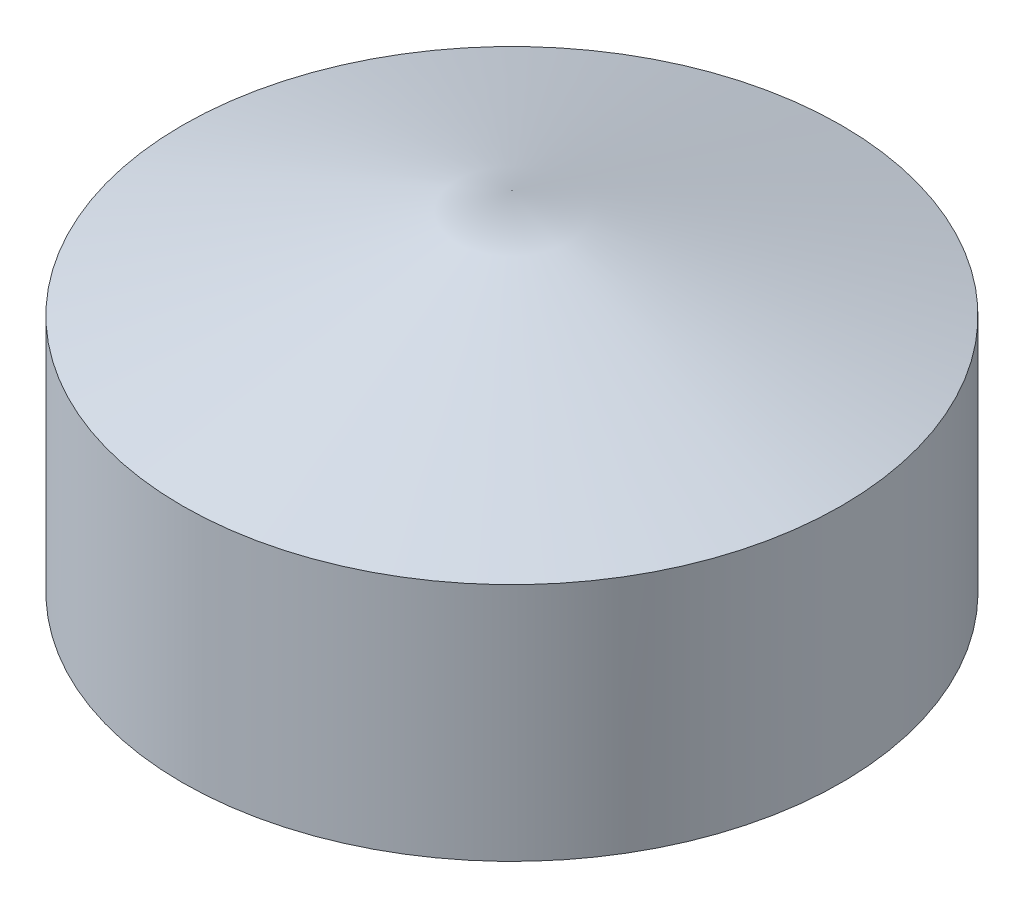
ISO-10303-21;
HEADER;
FILE_DESCRIPTION(('STEP AP214'),'2;1');
FILE_NAME('part.step','',(''),(''),'','','');
FILE_SCHEMA(('AUTOMOTIVE_DESIGN { 1 0 10303 214 1 1 1 1 }'));
ENDSEC;
DATA;
#1=APPLICATION_CONTEXT('core data for automotive mechanical design processes');
#2=APPLICATION_PROTOCOL_DEFINITION('international standard','automotive_design',2000,#1);
#3=PRODUCT_CONTEXT('',#1,'mechanical');
#4=PRODUCT('Part','Part','',(#3));
#5=PRODUCT_RELATED_PRODUCT_CATEGORY('part','',(#4));
#6=PRODUCT_DEFINITION_FORMATION('','',#4);
#7=PRODUCT_DEFINITION_CONTEXT('part definition',#1,'design');
#8=PRODUCT_DEFINITION('design','',#6,#7);
#9=PRODUCT_DEFINITION_SHAPE('','',#8);
#10=(LENGTH_UNIT() NAMED_UNIT(*) SI_UNIT(.MILLI.,.METRE.));
#11=(NAMED_UNIT(*) PLANE_ANGLE_UNIT() SI_UNIT($,.RADIAN.));
#12=(NAMED_UNIT(*) SI_UNIT($,.STERADIAN.) SOLID_ANGLE_UNIT());
#13=UNCERTAINTY_MEASURE_WITH_UNIT(LENGTH_MEASURE(1.E-05),#10,'distance_accuracy_value','');
#14=(GEOMETRIC_REPRESENTATION_CONTEXT(3) GLOBAL_UNCERTAINTY_ASSIGNED_CONTEXT((#13)) GLOBAL_UNIT_ASSIGNED_CONTEXT((#10,
#11,#12)) REPRESENTATION_CONTEXT('',''));
#15=CARTESIAN_POINT('',(0.,0.,0.));
#16=DIRECTION('',(0.,0.,1.));
#17=DIRECTION('',(1.,0.,0.));
#18=AXIS2_PLACEMENT_3D('',#15,#16,#17);
#19=CARTESIAN_POINT('',(0.,0.,0.));
#20=DIRECTION('',(0.,1.,0.));
#21=DIRECTION('',(0.,0.,1.));
#22=AXIS2_PLACEMENT_3D('',#19,#20,#21);
#23=PLANE('',#22);
#24=CARTESIAN_POINT('',(0.,0.,0.));
#25=DIRECTION('',(0.,1.,0.));
#26=DIRECTION('',(0.,0.,1.));
#27=AXIS2_PLACEMENT_3D('',#24,#25,#26);
#28=CIRCLE('',#27,11.);
#29=CARTESIAN_POINT('',(0.,0.,11.));
#30=VERTEX_POINT('',#29);
#31=EDGE_CURVE('E45',#30,#30,#28,.T.);
#32=ORIENTED_EDGE('',*,*,#31,.F.);
#33=EDGE_LOOP('',(#32));
#34=FACE_BOUND('',#33,.T.);
#35=CARTESIAN_POINT('',(0.,0.,0.));
#36=DIRECTION('',(0.,1.,0.));
#37=DIRECTION('',(0.,0.,1.));
#38=AXIS2_PLACEMENT_3D('',#35,#36,#37);
#39=CIRCLE('',#38,10.);
#40=CARTESIAN_POINT('',(0.,0.,10.));
#41=VERTEX_POINT('',#40);
#42=EDGE_CURVE('E66',#41,#41,#39,.T.);
#43=ORIENTED_EDGE('',*,*,#42,.T.);
#44=EDGE_LOOP('',(#43));
#45=FACE_BOUND('',#44,.T.);
#46=ADVANCED_FACE('F41',(#34,#45),#23,.F.);
#47=CARTESIAN_POINT('',(0.,8.,0.));
#48=DIRECTION('',(0.,-1.,0.));
#49=DIRECTION('',(0.,0.,-1.));
#50=AXIS2_PLACEMENT_3D('',#47,#48,#49);
#51=CYLINDRICAL_SURFACE('',#50,11.);
#52=CARTESIAN_POINT('',(0.,8.,0.));
#53=DIRECTION('',(0.,1.,0.));
#54=DIRECTION('',(0.,0.,1.));
#55=AXIS2_PLACEMENT_3D('',#52,#53,#54);
#56=CIRCLE('',#55,11.);
#57=CARTESIAN_POINT('',(0.,8.,11.));
#58=VERTEX_POINT('',#57);
#59=EDGE_CURVE('E11',#58,#58,#56,.T.);
#60=ORIENTED_EDGE('',*,*,#59,.F.);
#61=EDGE_LOOP('',(#60));
#62=FACE_BOUND('',#61,.T.);
#63=ORIENTED_EDGE('',*,*,#31,.T.);
#64=EDGE_LOOP('',(#63));
#65=FACE_BOUND('',#64,.T.);
#66=ADVANCED_FACE('F43',(#62,#65),#51,.T.);
#67=CARTESIAN_POINT('',(0.,8.,0.));
#68=DIRECTION('',(0.,-1.,0.));
#69=DIRECTION('',(0.,0.,-1.));
#70=AXIS2_PLACEMENT_3D('',#67,#68,#69);
#71=CYLINDRICAL_SURFACE('',#70,10.);
#72=CARTESIAN_POINT('',(0.,8.,0.));
#73=DIRECTION('',(0.,1.,0.));
#74=DIRECTION('',(0.,0.,1.));
#75=AXIS2_PLACEMENT_3D('',#72,#73,#74);
#76=CIRCLE('',#75,10.);
#77=CARTESIAN_POINT('',(0.,8.,10.));
#78=VERTEX_POINT('',#77);
#79=EDGE_CURVE('E69',#78,#78,#76,.T.);
#80=ORIENTED_EDGE('',*,*,#79,.T.);
#81=EDGE_LOOP('',(#80));
#82=FACE_BOUND('',#81,.T.);
#83=ORIENTED_EDGE('',*,*,#42,.F.);
#84=EDGE_LOOP('',(#83));
#85=FACE_BOUND('',#84,.T.);
#86=ADVANCED_FACE('F61',(#82,#85),#71,.F.);
#87=CARTESIAN_POINT('',(0.,8.,0.));
#88=DIRECTION('',(0.,1.,0.));
#89=DIRECTION('',(0.,0.,1.));
#90=AXIS2_PLACEMENT_3D('',#87,#88,#89);
#91=PLANE('',#90);
#92=ORIENTED_EDGE('',*,*,#79,.F.);
#93=EDGE_LOOP('',(#92));
#94=FACE_BOUND('',#93,.T.);
#95=ADVANCED_FACE('F55',(#94),#91,.F.);
#96=CARTESIAN_POINT('',(0.,8.,0.));
#97=DIRECTION('',(0.,-1.,0.));
#98=DIRECTION('',(0.,0.,-1.));
#99=AXIS2_PLACEMENT_3D('',#96,#97,#98);
#100=CONICAL_SURFACE('',#99,11.,1.25347155996195);
#101=CARTESIAN_POINT('',(0.,11.612653039169,0.));
#102=VERTEX_POINT('',#101);
#103=VERTEX_LOOP('',#102);
#104=FACE_BOUND('',#103,.T.);
#105=ORIENTED_EDGE('',*,*,#59,.T.);
#106=EDGE_LOOP('',(#105));
#107=FACE_BOUND('',#106,.T.);
#108=ADVANCED_FACE('F52',(#104,#107),#100,.T.);
#109=CLOSED_SHELL('',(#46,#66,#86,#95,#108));
#110=MANIFOLD_SOLID_BREP('B2',#109);
#111=ADVANCED_BREP_SHAPE_REPRESENTATION('',(#18,#110),#14);
#112=SHAPE_DEFINITION_REPRESENTATION(#9,#111);
ENDSEC;
END-ISO-10303-21;
